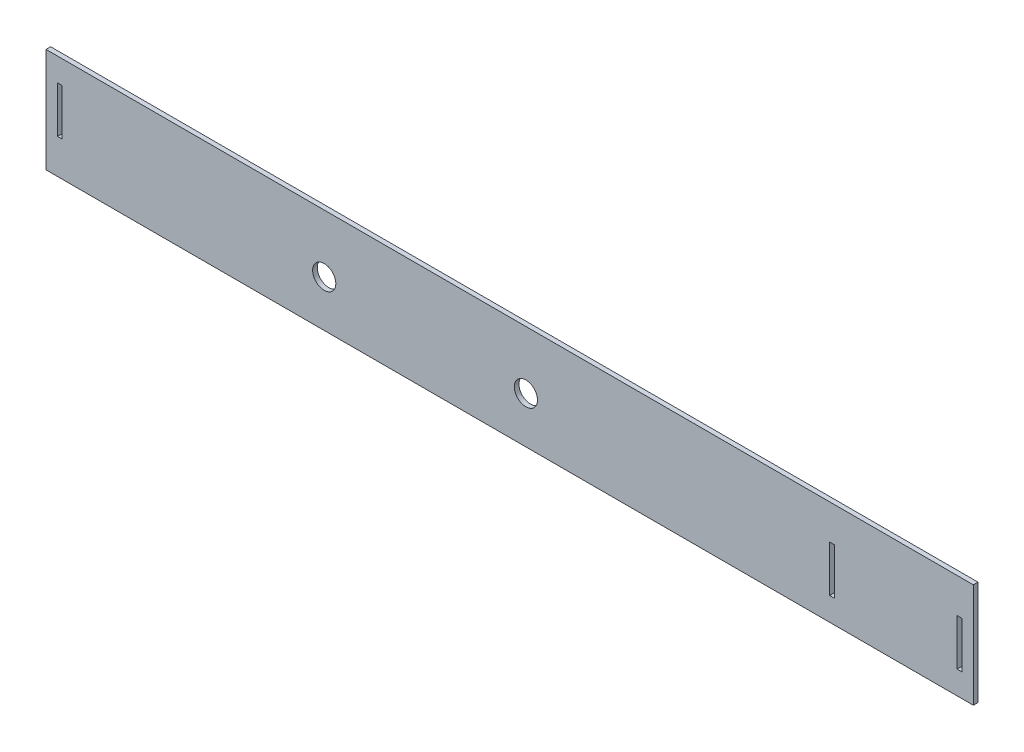
ISO-10303-21;
HEADER;
FILE_DESCRIPTION(('STEP AP214'),'2;1');
FILE_NAME('part.step','',(''),(''),'','','');
FILE_SCHEMA(('AUTOMOTIVE_DESIGN { 1 0 10303 214 1 1 1 1 }'));
ENDSEC;
DATA;
#1=APPLICATION_CONTEXT('core data for automotive mechanical design processes');
#2=APPLICATION_PROTOCOL_DEFINITION('international standard','automotive_design',2000,#1);
#3=PRODUCT_CONTEXT('',#1,'mechanical');
#4=PRODUCT('Part','Part','',(#3));
#5=PRODUCT_RELATED_PRODUCT_CATEGORY('part','',(#4));
#6=PRODUCT_DEFINITION_FORMATION('','',#4);
#7=PRODUCT_DEFINITION_CONTEXT('part definition',#1,'design');
#8=PRODUCT_DEFINITION('design','',#6,#7);
#9=PRODUCT_DEFINITION_SHAPE('','',#8);
#10=(LENGTH_UNIT() NAMED_UNIT(*) SI_UNIT(.MILLI.,.METRE.));
#11=(NAMED_UNIT(*) PLANE_ANGLE_UNIT() SI_UNIT($,.RADIAN.));
#12=(NAMED_UNIT(*) SI_UNIT($,.STERADIAN.) SOLID_ANGLE_UNIT());
#13=UNCERTAINTY_MEASURE_WITH_UNIT(LENGTH_MEASURE(1.E-05),#10,'distance_accuracy_value','');
#14=(GEOMETRIC_REPRESENTATION_CONTEXT(3) GLOBAL_UNCERTAINTY_ASSIGNED_CONTEXT((#13)) GLOBAL_UNIT_ASSIGNED_CONTEXT((#10,
#11,#12)) REPRESENTATION_CONTEXT('',''));
#15=CARTESIAN_POINT('',(0.,0.,0.));
#16=DIRECTION('',(0.,0.,1.));
#17=DIRECTION('',(1.,0.,0.));
#18=AXIS2_PLACEMENT_3D('',#15,#16,#17);
#19=CARTESIAN_POINT('',(0.,0.,2.));
#20=DIRECTION('',(0.,0.,-1.));
#21=DIRECTION('',(-1.,0.,0.));
#22=AXIS2_PLACEMENT_3D('',#19,#20,#21);
#23=PLANE('',#22);
#24=DIRECTION('',(0.,-1.,0.));
#25=VECTOR('',#24,1.);
#26=CARTESIAN_POINT('',(393.,30.,2.));
#27=LINE('',#26,#25);
#28=CARTESIAN_POINT('',(393.,30.,2.));
#29=VERTEX_POINT('',#28);
#30=CARTESIAN_POINT('',(393.,10.,2.));
#31=VERTEX_POINT('',#30);
#32=EDGE_CURVE('E182',#29,#31,#27,.T.);
#33=ORIENTED_EDGE('',*,*,#32,.F.);
#34=DIRECTION('',(-1.,0.,0.));
#35=VECTOR('',#34,1.);
#36=CARTESIAN_POINT('',(393.,30.,2.));
#37=LINE('',#36,#35);
#38=CARTESIAN_POINT('',(395.,30.,2.));
#39=VERTEX_POINT('',#38);
#40=EDGE_CURVE('E190',#39,#29,#37,.T.);
#41=ORIENTED_EDGE('',*,*,#40,.F.);
#42=DIRECTION('',(0.,1.,0.));
#43=VECTOR('',#42,1.);
#44=CARTESIAN_POINT('',(395.,30.,2.));
#45=LINE('',#44,#43);
#46=CARTESIAN_POINT('',(395.,10.,2.));
#47=VERTEX_POINT('',#46);
#48=EDGE_CURVE('E187',#47,#39,#45,.T.);
#49=ORIENTED_EDGE('',*,*,#48,.F.);
#50=DIRECTION('',(1.,0.,0.));
#51=VECTOR('',#50,1.);
#52=CARTESIAN_POINT('',(393.,10.,2.));
#53=LINE('',#52,#51);
#54=EDGE_CURVE('E184',#31,#47,#53,.T.);
#55=ORIENTED_EDGE('',*,*,#54,.F.);
#56=EDGE_LOOP('',(#33,#41,#49,#55));
#57=FACE_BOUND('',#56,.T.);
#58=CARTESIAN_POINT('',(207.,20.,2.));
#59=DIRECTION('',(0.,0.,1.));
#60=DIRECTION('',(1.,0.,0.));
#61=AXIS2_PLACEMENT_3D('',#58,#59,#60);
#62=CIRCLE('',#61,5.00000000000002);
#63=CARTESIAN_POINT('',(212.,20.,2.));
#64=VERTEX_POINT('',#63);
#65=EDGE_CURVE('E244',#64,#64,#62,.T.);
#66=ORIENTED_EDGE('',*,*,#65,.F.);
#67=EDGE_LOOP('',(#66));
#68=FACE_BOUND('',#67,.T.);
#69=CARTESIAN_POINT('',(120.,20.,2.));
#70=DIRECTION('',(0.,0.,1.));
#71=DIRECTION('',(1.,0.,0.));
#72=AXIS2_PLACEMENT_3D('',#69,#70,#71);
#73=CIRCLE('',#72,5.);
#74=CARTESIAN_POINT('',(125.,20.,2.));
#75=VERTEX_POINT('',#74);
#76=EDGE_CURVE('E250',#75,#75,#73,.T.);
#77=ORIENTED_EDGE('',*,*,#76,.F.);
#78=EDGE_LOOP('',(#77));
#79=FACE_BOUND('',#78,.T.);
#80=DIRECTION('',(0.,-1.,0.));
#81=VECTOR('',#80,1.);
#82=CARTESIAN_POINT('',(0.,0.,2.));
#83=LINE('',#82,#81);
#84=CARTESIAN_POINT('',(0.,45.,2.));
#85=VERTEX_POINT('',#84);
#86=CARTESIAN_POINT('',(0.,0.,2.));
#87=VERTEX_POINT('',#86);
#88=EDGE_CURVE('E256',#85,#87,#83,.T.);
#89=ORIENTED_EDGE('',*,*,#88,.T.);
#90=DIRECTION('',(1.,0.,0.));
#91=VECTOR('',#90,1.);
#92=CARTESIAN_POINT('',(0.,0.,2.));
#93=LINE('',#92,#91);
#94=CARTESIAN_POINT('',(400.,0.,2.));
#95=VERTEX_POINT('',#94);
#96=EDGE_CURVE('E259',#87,#95,#93,.T.);
#97=ORIENTED_EDGE('',*,*,#96,.T.);
#98=DIRECTION('',(0.,1.,0.));
#99=VECTOR('',#98,1.);
#100=CARTESIAN_POINT('',(400.,0.,2.));
#101=LINE('',#100,#99);
#102=CARTESIAN_POINT('',(400.,45.,2.));
#103=VERTEX_POINT('',#102);
#104=EDGE_CURVE('E262',#95,#103,#101,.T.);
#105=ORIENTED_EDGE('',*,*,#104,.T.);
#106=DIRECTION('',(-1.,0.,0.));
#107=VECTOR('',#106,1.);
#108=CARTESIAN_POINT('',(0.,45.,2.));
#109=LINE('',#108,#107);
#110=EDGE_CURVE('E264',#103,#85,#109,.T.);
#111=ORIENTED_EDGE('',*,*,#110,.T.);
#112=EDGE_LOOP('',(#89,#97,#105,#111));
#113=FACE_BOUND('',#112,.T.);
#114=DIRECTION('',(0.,-1.,0.));
#115=VECTOR('',#114,1.);
#116=CARTESIAN_POINT('',(338.,30.,2.));
#117=LINE('',#116,#115);
#118=CARTESIAN_POINT('',(338.,30.,2.));
#119=VERTEX_POINT('',#118);
#120=CARTESIAN_POINT('',(338.,10.,2.));
#121=VERTEX_POINT('',#120);
#122=EDGE_CURVE('E213',#119,#121,#117,.T.);
#123=ORIENTED_EDGE('',*,*,#122,.F.);
#124=DIRECTION('',(-1.,0.,0.));
#125=VECTOR('',#124,1.);
#126=CARTESIAN_POINT('',(338.,30.,2.));
#127=LINE('',#126,#125);
#128=CARTESIAN_POINT('',(340.,30.,2.));
#129=VERTEX_POINT('',#128);
#130=EDGE_CURVE('E221',#129,#119,#127,.T.);
#131=ORIENTED_EDGE('',*,*,#130,.F.);
#132=DIRECTION('',(0.,1.,0.));
#133=VECTOR('',#132,1.);
#134=CARTESIAN_POINT('',(340.,30.,2.));
#135=LINE('',#134,#133);
#136=CARTESIAN_POINT('',(340.,10.,2.));
#137=VERTEX_POINT('',#136);
#138=EDGE_CURVE('E218',#137,#129,#135,.T.);
#139=ORIENTED_EDGE('',*,*,#138,.F.);
#140=DIRECTION('',(1.,0.,0.));
#141=VECTOR('',#140,1.);
#142=CARTESIAN_POINT('',(338.,10.,2.));
#143=LINE('',#142,#141);
#144=EDGE_CURVE('E215',#121,#137,#143,.T.);
#145=ORIENTED_EDGE('',*,*,#144,.F.);
#146=EDGE_LOOP('',(#123,#131,#139,#145));
#147=FACE_BOUND('',#146,.T.);
#148=DIRECTION('',(0.,-1.,0.));
#149=VECTOR('',#148,1.);
#150=CARTESIAN_POINT('',(5.,35.,2.));
#151=LINE('',#150,#149);
#152=CARTESIAN_POINT('',(5.,35.,2.));
#153=VERTEX_POINT('',#152);
#154=CARTESIAN_POINT('',(5.,15.,2.));
#155=VERTEX_POINT('',#154);
#156=EDGE_CURVE('E146',#153,#155,#151,.T.);
#157=ORIENTED_EDGE('',*,*,#156,.F.);
#158=DIRECTION('',(-1.,0.,0.));
#159=VECTOR('',#158,1.);
#160=CARTESIAN_POINT('',(5.,35.,2.));
#161=LINE('',#160,#159);
#162=CARTESIAN_POINT('',(7.,35.,2.));
#163=VERTEX_POINT('',#162);
#164=EDGE_CURVE('E168',#163,#153,#161,.T.);
#165=ORIENTED_EDGE('',*,*,#164,.F.);
#166=DIRECTION('',(0.,1.,0.));
#167=VECTOR('',#166,1.);
#168=CARTESIAN_POINT('',(7.,35.,2.));
#169=LINE('',#168,#167);
#170=CARTESIAN_POINT('',(7.,15.,2.));
#171=VERTEX_POINT('',#170);
#172=EDGE_CURVE('E166',#171,#163,#169,.T.);
#173=ORIENTED_EDGE('',*,*,#172,.F.);
#174=DIRECTION('',(1.,0.,0.));
#175=VECTOR('',#174,1.);
#176=CARTESIAN_POINT('',(5.,15.,2.));
#177=LINE('',#176,#175);
#178=EDGE_CURVE('E154',#155,#171,#177,.T.);
#179=ORIENTED_EDGE('',*,*,#178,.F.);
#180=EDGE_LOOP('',(#157,#165,#173,#179));
#181=FACE_BOUND('',#180,.T.);
#182=ADVANCED_FACE('F33',(#57,#68,#79,#113,#147,#181),#23,.F.);
#183=CARTESIAN_POINT('',(0.,0.,0.));
#184=DIRECTION('',(0.,0.,-1.));
#185=DIRECTION('',(-1.,0.,0.));
#186=AXIS2_PLACEMENT_3D('',#183,#184,#185);
#187=PLANE('',#186);
#188=CARTESIAN_POINT('',(120.,20.,0.));
#189=DIRECTION('',(0.,0.,1.));
#190=DIRECTION('',(1.,0.,0.));
#191=AXIS2_PLACEMENT_3D('',#188,#189,#190);
#192=CIRCLE('',#191,5.);
#193=CARTESIAN_POINT('',(125.,20.,0.));
#194=VERTEX_POINT('',#193);
#195=EDGE_CURVE('E247',#194,#194,#192,.T.);
#196=ORIENTED_EDGE('',*,*,#195,.T.);
#197=EDGE_LOOP('',(#196));
#198=FACE_BOUND('',#197,.T.);
#199=DIRECTION('',(0.,-1.,0.));
#200=VECTOR('',#199,1.);
#201=CARTESIAN_POINT('',(0.,0.,0.));
#202=LINE('',#201,#200);
#203=CARTESIAN_POINT('',(0.,45.,0.));
#204=VERTEX_POINT('',#203);
#205=CARTESIAN_POINT('',(0.,0.,0.));
#206=VERTEX_POINT('',#205);
#207=EDGE_CURVE('E253',#204,#206,#202,.T.);
#208=ORIENTED_EDGE('',*,*,#207,.F.);
#209=DIRECTION('',(-1.,0.,0.));
#210=VECTOR('',#209,1.);
#211=CARTESIAN_POINT('',(0.,45.,0.));
#212=LINE('',#211,#210);
#213=CARTESIAN_POINT('',(400.,45.,0.));
#214=VERTEX_POINT('',#213);
#215=EDGE_CURVE('E260',#214,#204,#212,.T.);
#216=ORIENTED_EDGE('',*,*,#215,.F.);
#217=DIRECTION('',(0.,1.,0.));
#218=VECTOR('',#217,1.);
#219=CARTESIAN_POINT('',(400.,0.,0.));
#220=LINE('',#219,#218);
#221=CARTESIAN_POINT('',(400.,0.,0.));
#222=VERTEX_POINT('',#221);
#223=EDGE_CURVE('E271',#222,#214,#220,.T.);
#224=ORIENTED_EDGE('',*,*,#223,.F.);
#225=DIRECTION('',(1.,0.,0.));
#226=VECTOR('',#225,1.);
#227=CARTESIAN_POINT('',(0.,0.,0.));
#228=LINE('',#227,#226);
#229=EDGE_CURVE('E269',#206,#222,#228,.T.);
#230=ORIENTED_EDGE('',*,*,#229,.F.);
#231=EDGE_LOOP('',(#208,#216,#224,#230));
#232=FACE_BOUND('',#231,.T.);
#233=CARTESIAN_POINT('',(207.,20.,0.));
#234=DIRECTION('',(0.,0.,1.));
#235=DIRECTION('',(1.,0.,0.));
#236=AXIS2_PLACEMENT_3D('',#233,#234,#235);
#237=CIRCLE('',#236,5.00000000000002);
#238=CARTESIAN_POINT('',(212.,20.,0.));
#239=VERTEX_POINT('',#238);
#240=EDGE_CURVE('E243',#239,#239,#237,.T.);
#241=ORIENTED_EDGE('',*,*,#240,.T.);
#242=EDGE_LOOP('',(#241));
#243=FACE_BOUND('',#242,.T.);
#244=DIRECTION('',(-1.,0.,0.));
#245=VECTOR('',#244,1.);
#246=CARTESIAN_POINT('',(338.,30.,0.));
#247=LINE('',#246,#245);
#248=CARTESIAN_POINT('',(340.,30.,0.));
#249=VERTEX_POINT('',#248);
#250=CARTESIAN_POINT('',(338.,30.,0.));
#251=VERTEX_POINT('',#250);
#252=EDGE_CURVE('E216',#249,#251,#247,.T.);
#253=ORIENTED_EDGE('',*,*,#252,.T.);
#254=DIRECTION('',(0.,-1.,0.));
#255=VECTOR('',#254,1.);
#256=CARTESIAN_POINT('',(338.,30.,0.));
#257=LINE('',#256,#255);
#258=CARTESIAN_POINT('',(338.,10.,0.));
#259=VERTEX_POINT('',#258);
#260=EDGE_CURVE('E212',#251,#259,#257,.T.);
#261=ORIENTED_EDGE('',*,*,#260,.T.);
#262=DIRECTION('',(1.,0.,0.));
#263=VECTOR('',#262,1.);
#264=CARTESIAN_POINT('',(338.,10.,0.));
#265=LINE('',#264,#263);
#266=CARTESIAN_POINT('',(340.,10.,0.));
#267=VERTEX_POINT('',#266);
#268=EDGE_CURVE('E226',#259,#267,#265,.T.);
#269=ORIENTED_EDGE('',*,*,#268,.T.);
#270=DIRECTION('',(0.,1.,0.));
#271=VECTOR('',#270,1.);
#272=CARTESIAN_POINT('',(340.,30.,0.));
#273=LINE('',#272,#271);
#274=EDGE_CURVE('E229',#267,#249,#273,.T.);
#275=ORIENTED_EDGE('',*,*,#274,.T.);
#276=EDGE_LOOP('',(#253,#261,#269,#275));
#277=FACE_BOUND('',#276,.T.);
#278=DIRECTION('',(-1.,0.,0.));
#279=VECTOR('',#278,1.);
#280=CARTESIAN_POINT('',(393.,30.,0.));
#281=LINE('',#280,#279);
#282=CARTESIAN_POINT('',(395.,30.,0.));
#283=VERTEX_POINT('',#282);
#284=CARTESIAN_POINT('',(393.,30.,0.));
#285=VERTEX_POINT('',#284);
#286=EDGE_CURVE('E185',#283,#285,#281,.T.);
#287=ORIENTED_EDGE('',*,*,#286,.T.);
#288=DIRECTION('',(0.,-1.,0.));
#289=VECTOR('',#288,1.);
#290=CARTESIAN_POINT('',(393.,30.,0.));
#291=LINE('',#290,#289);
#292=CARTESIAN_POINT('',(393.,10.,0.));
#293=VERTEX_POINT('',#292);
#294=EDGE_CURVE('E162',#285,#293,#291,.T.);
#295=ORIENTED_EDGE('',*,*,#294,.T.);
#296=DIRECTION('',(1.,0.,0.));
#297=VECTOR('',#296,1.);
#298=CARTESIAN_POINT('',(393.,10.,0.));
#299=LINE('',#298,#297);
#300=CARTESIAN_POINT('',(395.,10.,0.));
#301=VERTEX_POINT('',#300);
#302=EDGE_CURVE('E195',#293,#301,#299,.T.);
#303=ORIENTED_EDGE('',*,*,#302,.T.);
#304=DIRECTION('',(0.,1.,0.));
#305=VECTOR('',#304,1.);
#306=CARTESIAN_POINT('',(395.,30.,0.));
#307=LINE('',#306,#305);
#308=EDGE_CURVE('E198',#301,#283,#307,.T.);
#309=ORIENTED_EDGE('',*,*,#308,.T.);
#310=EDGE_LOOP('',(#287,#295,#303,#309));
#311=FACE_BOUND('',#310,.T.);
#312=DIRECTION('',(-1.,0.,0.));
#313=VECTOR('',#312,1.);
#314=CARTESIAN_POINT('',(5.,35.,0.));
#315=LINE('',#314,#313);
#316=CARTESIAN_POINT('',(7.,35.,0.));
#317=VERTEX_POINT('',#316);
#318=CARTESIAN_POINT('',(5.,35.,0.));
#319=VERTEX_POINT('',#318);
#320=EDGE_CURVE('E155',#317,#319,#315,.T.);
#321=ORIENTED_EDGE('',*,*,#320,.T.);
#322=DIRECTION('',(0.,-1.,0.));
#323=VECTOR('',#322,1.);
#324=CARTESIAN_POINT('',(5.,35.,0.));
#325=LINE('',#324,#323);
#326=CARTESIAN_POINT('',(5.,15.,0.));
#327=VERTEX_POINT('',#326);
#328=EDGE_CURVE('E56',#319,#327,#325,.T.);
#329=ORIENTED_EDGE('',*,*,#328,.T.);
#330=DIRECTION('',(1.,0.,0.));
#331=VECTOR('',#330,1.);
#332=CARTESIAN_POINT('',(5.,15.,0.));
#333=LINE('',#332,#331);
#334=CARTESIAN_POINT('',(7.,15.,0.));
#335=VERTEX_POINT('',#334);
#336=EDGE_CURVE('E161',#327,#335,#333,.T.);
#337=ORIENTED_EDGE('',*,*,#336,.T.);
#338=DIRECTION('',(0.,1.,0.));
#339=VECTOR('',#338,1.);
#340=CARTESIAN_POINT('',(7.,35.,0.));
#341=LINE('',#340,#339);
#342=EDGE_CURVE('E174',#335,#317,#341,.T.);
#343=ORIENTED_EDGE('',*,*,#342,.T.);
#344=EDGE_LOOP('',(#321,#329,#337,#343));
#345=FACE_BOUND('',#344,.T.);
#346=ADVANCED_FACE('F289',(#198,#232,#243,#277,#311,#345),#187,.T.);
#347=CARTESIAN_POINT('',(0.,0.,2.));
#348=DIRECTION('',(1.,0.,0.));
#349=DIRECTION('',(0.,0.,-1.));
#350=AXIS2_PLACEMENT_3D('',#347,#348,#349);
#351=PLANE('',#350);
#352=ORIENTED_EDGE('',*,*,#207,.T.);
#353=DIRECTION('',(0.,0.,-1.));
#354=VECTOR('',#353,1.);
#355=CARTESIAN_POINT('',(0.,0.,2.));
#356=LINE('',#355,#354);
#357=EDGE_CURVE('E11',#87,#206,#356,.T.);
#358=ORIENTED_EDGE('',*,*,#357,.F.);
#359=ORIENTED_EDGE('',*,*,#88,.F.);
#360=DIRECTION('',(0.,0.,-1.));
#361=VECTOR('',#360,1.);
#362=CARTESIAN_POINT('',(0.,45.,2.));
#363=LINE('',#362,#361);
#364=EDGE_CURVE('E266',#85,#204,#363,.T.);
#365=ORIENTED_EDGE('',*,*,#364,.T.);
#366=EDGE_LOOP('',(#352,#358,#359,#365));
#367=FACE_BOUND('',#366,.T.);
#368=ADVANCED_FACE('F35',(#367),#351,.F.);
#369=CARTESIAN_POINT('',(0.,0.,2.));
#370=DIRECTION('',(0.,1.,0.));
#371=DIRECTION('',(0.,0.,1.));
#372=AXIS2_PLACEMENT_3D('',#369,#370,#371);
#373=PLANE('',#372);
#374=ORIENTED_EDGE('',*,*,#229,.T.);
#375=DIRECTION('',(0.,0.,-1.));
#376=VECTOR('',#375,1.);
#377=CARTESIAN_POINT('',(400.,0.,2.));
#378=LINE('',#377,#376);
#379=EDGE_CURVE('E41',#95,#222,#378,.T.);
#380=ORIENTED_EDGE('',*,*,#379,.F.);
#381=ORIENTED_EDGE('',*,*,#96,.F.);
#382=ORIENTED_EDGE('',*,*,#357,.T.);
#383=EDGE_LOOP('',(#374,#380,#381,#382));
#384=FACE_BOUND('',#383,.T.);
#385=ADVANCED_FACE('F300',(#384),#373,.F.);
#386=CARTESIAN_POINT('',(400.,0.,2.));
#387=DIRECTION('',(-1.,0.,0.));
#388=DIRECTION('',(0.,0.,1.));
#389=AXIS2_PLACEMENT_3D('',#386,#387,#388);
#390=PLANE('',#389);
#391=ORIENTED_EDGE('',*,*,#223,.T.);
#392=DIRECTION('',(0.,0.,-1.));
#393=VECTOR('',#392,1.);
#394=CARTESIAN_POINT('',(400.,45.,2.));
#395=LINE('',#394,#393);
#396=EDGE_CURVE('E276',#103,#214,#395,.T.);
#397=ORIENTED_EDGE('',*,*,#396,.F.);
#398=ORIENTED_EDGE('',*,*,#104,.F.);
#399=ORIENTED_EDGE('',*,*,#379,.T.);
#400=EDGE_LOOP('',(#391,#397,#398,#399));
#401=FACE_BOUND('',#400,.T.);
#402=ADVANCED_FACE('F283',(#401),#390,.F.);
#403=CARTESIAN_POINT('',(0.,45.,2.));
#404=DIRECTION('',(0.,-1.,0.));
#405=DIRECTION('',(0.,0.,-1.));
#406=AXIS2_PLACEMENT_3D('',#403,#404,#405);
#407=PLANE('',#406);
#408=ORIENTED_EDGE('',*,*,#215,.T.);
#409=ORIENTED_EDGE('',*,*,#364,.F.);
#410=ORIENTED_EDGE('',*,*,#110,.F.);
#411=ORIENTED_EDGE('',*,*,#396,.T.);
#412=EDGE_LOOP('',(#408,#409,#410,#411));
#413=FACE_BOUND('',#412,.T.);
#414=ADVANCED_FACE('F293',(#413),#407,.F.);
#415=CARTESIAN_POINT('',(120.,20.,2.));
#416=DIRECTION('',(0.,0.,-1.));
#417=DIRECTION('',(-1.,0.,0.));
#418=AXIS2_PLACEMENT_3D('',#415,#416,#417);
#419=CYLINDRICAL_SURFACE('',#418,5.);
#420=ORIENTED_EDGE('',*,*,#76,.T.);
#421=EDGE_LOOP('',(#420));
#422=FACE_BOUND('',#421,.T.);
#423=ORIENTED_EDGE('',*,*,#195,.F.);
#424=EDGE_LOOP('',(#423));
#425=FACE_BOUND('',#424,.T.);
#426=ADVANCED_FACE('F318',(#422,#425),#419,.F.);
#427=CARTESIAN_POINT('',(207.,20.,2.));
#428=DIRECTION('',(0.,0.,-1.));
#429=DIRECTION('',(-1.,0.,0.));
#430=AXIS2_PLACEMENT_3D('',#427,#428,#429);
#431=CYLINDRICAL_SURFACE('',#430,5.00000000000002);
#432=ORIENTED_EDGE('',*,*,#65,.T.);
#433=EDGE_LOOP('',(#432));
#434=FACE_BOUND('',#433,.T.);
#435=ORIENTED_EDGE('',*,*,#240,.F.);
#436=EDGE_LOOP('',(#435));
#437=FACE_BOUND('',#436,.T.);
#438=ADVANCED_FACE('F325',(#434,#437),#431,.F.);
#439=CARTESIAN_POINT('',(338.,30.,2.));
#440=DIRECTION('',(1.,0.,0.));
#441=DIRECTION('',(0.,0.,-1.));
#442=AXIS2_PLACEMENT_3D('',#439,#440,#441);
#443=PLANE('',#442);
#444=ORIENTED_EDGE('',*,*,#260,.F.);
#445=DIRECTION('',(0.,0.,-1.));
#446=VECTOR('',#445,1.);
#447=CARTESIAN_POINT('',(338.,30.,2.));
#448=LINE('',#447,#446);
#449=EDGE_CURVE('E223',#119,#251,#448,.T.);
#450=ORIENTED_EDGE('',*,*,#449,.F.);
#451=ORIENTED_EDGE('',*,*,#122,.T.);
#452=DIRECTION('',(0.,0.,-1.));
#453=VECTOR('',#452,1.);
#454=CARTESIAN_POINT('',(338.,10.,2.));
#455=LINE('',#454,#453);
#456=EDGE_CURVE('E240',#121,#259,#455,.T.);
#457=ORIENTED_EDGE('',*,*,#456,.T.);
#458=EDGE_LOOP('',(#444,#450,#451,#457));
#459=FACE_BOUND('',#458,.T.);
#460=ADVANCED_FACE('F330',(#459),#443,.T.);
#461=CARTESIAN_POINT('',(338.,10.,2.));
#462=DIRECTION('',(0.,1.,0.));
#463=DIRECTION('',(-1.,0.,0.));
#464=AXIS2_PLACEMENT_3D('',#461,#462,#463);
#465=PLANE('',#464);
#466=ORIENTED_EDGE('',*,*,#268,.F.);
#467=ORIENTED_EDGE('',*,*,#456,.F.);
#468=ORIENTED_EDGE('',*,*,#144,.T.);
#469=DIRECTION('',(0.,0.,-1.));
#470=VECTOR('',#469,1.);
#471=CARTESIAN_POINT('',(340.,10.,2.));
#472=LINE('',#471,#470);
#473=EDGE_CURVE('E238',#137,#267,#472,.T.);
#474=ORIENTED_EDGE('',*,*,#473,.T.);
#475=EDGE_LOOP('',(#466,#467,#468,#474));
#476=FACE_BOUND('',#475,.T.);
#477=ADVANCED_FACE('F339',(#476),#465,.T.);
#478=CARTESIAN_POINT('',(340.,30.,2.));
#479=DIRECTION('',(-1.,0.,0.));
#480=DIRECTION('',(0.,0.,1.));
#481=AXIS2_PLACEMENT_3D('',#478,#479,#480);
#482=PLANE('',#481);
#483=ORIENTED_EDGE('',*,*,#274,.F.);
#484=ORIENTED_EDGE('',*,*,#473,.F.);
#485=ORIENTED_EDGE('',*,*,#138,.T.);
#486=DIRECTION('',(0.,0.,-1.));
#487=VECTOR('',#486,1.);
#488=CARTESIAN_POINT('',(340.,30.,2.));
#489=LINE('',#488,#487);
#490=EDGE_CURVE('E236',#129,#249,#489,.T.);
#491=ORIENTED_EDGE('',*,*,#490,.T.);
#492=EDGE_LOOP('',(#483,#484,#485,#491));
#493=FACE_BOUND('',#492,.T.);
#494=ADVANCED_FACE('F346',(#493),#482,.T.);
#495=CARTESIAN_POINT('',(338.,30.,2.));
#496=DIRECTION('',(0.,-1.,0.));
#497=DIRECTION('',(0.,0.,-1.));
#498=AXIS2_PLACEMENT_3D('',#495,#496,#497);
#499=PLANE('',#498);
#500=ORIENTED_EDGE('',*,*,#252,.F.);
#501=ORIENTED_EDGE('',*,*,#490,.F.);
#502=ORIENTED_EDGE('',*,*,#130,.T.);
#503=ORIENTED_EDGE('',*,*,#449,.T.);
#504=EDGE_LOOP('',(#500,#501,#502,#503));
#505=FACE_BOUND('',#504,.T.);
#506=ADVANCED_FACE('F350',(#505),#499,.T.);
#507=CARTESIAN_POINT('',(393.,30.,2.));
#508=DIRECTION('',(1.,0.,0.));
#509=DIRECTION('',(0.,0.,-1.));
#510=AXIS2_PLACEMENT_3D('',#507,#508,#509);
#511=PLANE('',#510);
#512=ORIENTED_EDGE('',*,*,#294,.F.);
#513=DIRECTION('',(0.,0.,-1.));
#514=VECTOR('',#513,1.);
#515=CARTESIAN_POINT('',(393.,30.,2.));
#516=LINE('',#515,#514);
#517=EDGE_CURVE('E192',#29,#285,#516,.T.);
#518=ORIENTED_EDGE('',*,*,#517,.F.);
#519=ORIENTED_EDGE('',*,*,#32,.T.);
#520=DIRECTION('',(0.,0.,-1.));
#521=VECTOR('',#520,1.);
#522=CARTESIAN_POINT('',(393.,10.,2.));
#523=LINE('',#522,#521);
#524=EDGE_CURVE('E209',#31,#293,#523,.T.);
#525=ORIENTED_EDGE('',*,*,#524,.T.);
#526=EDGE_LOOP('',(#512,#518,#519,#525));
#527=FACE_BOUND('',#526,.T.);
#528=ADVANCED_FACE('F354',(#527),#511,.T.);
#529=CARTESIAN_POINT('',(393.,10.,2.));
#530=DIRECTION('',(0.,1.,0.));
#531=DIRECTION('',(0.,0.,1.));
#532=AXIS2_PLACEMENT_3D('',#529,#530,#531);
#533=PLANE('',#532);
#534=ORIENTED_EDGE('',*,*,#302,.F.);
#535=ORIENTED_EDGE('',*,*,#524,.F.);
#536=ORIENTED_EDGE('',*,*,#54,.T.);
#537=DIRECTION('',(0.,0.,-1.));
#538=VECTOR('',#537,1.);
#539=CARTESIAN_POINT('',(395.,10.,2.));
#540=LINE('',#539,#538);
#541=EDGE_CURVE('E207',#47,#301,#540,.T.);
#542=ORIENTED_EDGE('',*,*,#541,.T.);
#543=EDGE_LOOP('',(#534,#535,#536,#542));
#544=FACE_BOUND('',#543,.T.);
#545=ADVANCED_FACE('F358',(#544),#533,.T.);
#546=CARTESIAN_POINT('',(395.,30.,2.));
#547=DIRECTION('',(-1.,0.,0.));
#548=DIRECTION('',(0.,0.,1.));
#549=AXIS2_PLACEMENT_3D('',#546,#547,#548);
#550=PLANE('',#549);
#551=ORIENTED_EDGE('',*,*,#308,.F.);
#552=ORIENTED_EDGE('',*,*,#541,.F.);
#553=ORIENTED_EDGE('',*,*,#48,.T.);
#554=DIRECTION('',(0.,0.,-1.));
#555=VECTOR('',#554,1.);
#556=CARTESIAN_POINT('',(395.,30.,2.));
#557=LINE('',#556,#555);
#558=EDGE_CURVE('E205',#39,#283,#557,.T.);
#559=ORIENTED_EDGE('',*,*,#558,.T.);
#560=EDGE_LOOP('',(#551,#552,#553,#559));
#561=FACE_BOUND('',#560,.T.);
#562=ADVANCED_FACE('F362',(#561),#550,.T.);
#563=CARTESIAN_POINT('',(393.,30.,2.));
#564=DIRECTION('',(0.,-1.,0.));
#565=DIRECTION('',(0.,0.,-1.));
#566=AXIS2_PLACEMENT_3D('',#563,#564,#565);
#567=PLANE('',#566);
#568=ORIENTED_EDGE('',*,*,#286,.F.);
#569=ORIENTED_EDGE('',*,*,#558,.F.);
#570=ORIENTED_EDGE('',*,*,#40,.T.);
#571=ORIENTED_EDGE('',*,*,#517,.T.);
#572=EDGE_LOOP('',(#568,#569,#570,#571));
#573=FACE_BOUND('',#572,.T.);
#574=ADVANCED_FACE('F366',(#573),#567,.T.);
#575=CARTESIAN_POINT('',(5.,35.,2.));
#576=DIRECTION('',(1.,0.,0.));
#577=DIRECTION('',(0.,1.,0.));
#578=AXIS2_PLACEMENT_3D('',#575,#576,#577);
#579=PLANE('',#578);
#580=ORIENTED_EDGE('',*,*,#328,.F.);
#581=DIRECTION('',(0.,0.,-1.));
#582=VECTOR('',#581,1.);
#583=CARTESIAN_POINT('',(5.,35.,2.));
#584=LINE('',#583,#582);
#585=EDGE_CURVE('E150',#153,#319,#584,.T.);
#586=ORIENTED_EDGE('',*,*,#585,.F.);
#587=ORIENTED_EDGE('',*,*,#156,.T.);
#588=DIRECTION('',(0.,0.,-1.));
#589=VECTOR('',#588,1.);
#590=CARTESIAN_POINT('',(5.,15.,2.));
#591=LINE('',#590,#589);
#592=EDGE_CURVE('E149',#155,#327,#591,.T.);
#593=ORIENTED_EDGE('',*,*,#592,.T.);
#594=EDGE_LOOP('',(#580,#586,#587,#593));
#595=FACE_BOUND('',#594,.T.);
#596=ADVANCED_FACE('F148',(#595),#579,.T.);
#597=CARTESIAN_POINT('',(5.,15.,2.));
#598=DIRECTION('',(0.,1.,0.));
#599=DIRECTION('',(0.,0.,1.));
#600=AXIS2_PLACEMENT_3D('',#597,#598,#599);
#601=PLANE('',#600);
#602=ORIENTED_EDGE('',*,*,#336,.F.);
#603=ORIENTED_EDGE('',*,*,#592,.F.);
#604=ORIENTED_EDGE('',*,*,#178,.T.);
#605=DIRECTION('',(0.,0.,-1.));
#606=VECTOR('',#605,1.);
#607=CARTESIAN_POINT('',(7.,15.,2.));
#608=LINE('',#607,#606);
#609=EDGE_CURVE('E163',#171,#335,#608,.T.);
#610=ORIENTED_EDGE('',*,*,#609,.T.);
#611=EDGE_LOOP('',(#602,#603,#604,#610));
#612=FACE_BOUND('',#611,.T.);
#613=ADVANCED_FACE('F158',(#612),#601,.T.);
#614=CARTESIAN_POINT('',(7.,35.,2.));
#615=DIRECTION('',(-1.,0.,0.));
#616=DIRECTION('',(0.,-1.,0.));
#617=AXIS2_PLACEMENT_3D('',#614,#615,#616);
#618=PLANE('',#617);
#619=ORIENTED_EDGE('',*,*,#342,.F.);
#620=ORIENTED_EDGE('',*,*,#609,.F.);
#621=ORIENTED_EDGE('',*,*,#172,.T.);
#622=DIRECTION('',(0.,0.,-1.));
#623=VECTOR('',#622,1.);
#624=CARTESIAN_POINT('',(7.,35.,2.));
#625=LINE('',#624,#623);
#626=EDGE_CURVE('E48',#163,#317,#625,.T.);
#627=ORIENTED_EDGE('',*,*,#626,.T.);
#628=EDGE_LOOP('',(#619,#620,#621,#627));
#629=FACE_BOUND('',#628,.T.);
#630=ADVANCED_FACE('F375',(#629),#618,.T.);
#631=CARTESIAN_POINT('',(5.,35.,2.));
#632=DIRECTION('',(0.,-1.,0.));
#633=DIRECTION('',(0.,0.,-1.));
#634=AXIS2_PLACEMENT_3D('',#631,#632,#633);
#635=PLANE('',#634);
#636=ORIENTED_EDGE('',*,*,#320,.F.);
#637=ORIENTED_EDGE('',*,*,#626,.F.);
#638=ORIENTED_EDGE('',*,*,#164,.T.);
#639=ORIENTED_EDGE('',*,*,#585,.T.);
#640=EDGE_LOOP('',(#636,#637,#638,#639));
#641=FACE_BOUND('',#640,.T.);
#642=ADVANCED_FACE('F378',(#641),#635,.T.);
#643=CLOSED_SHELL('',(#182,#346,#368,#385,#402,#414,#426,#438,#460,#477,#494,#506,#528,#545,
#562,#574,#596,#613,#630,#642));
#644=MANIFOLD_SOLID_BREP('B2',#643);
#645=ADVANCED_BREP_SHAPE_REPRESENTATION('',(#18,#644),#14);
#646=SHAPE_DEFINITION_REPRESENTATION(#9,#645);
ENDSEC;
END-ISO-10303-21;
